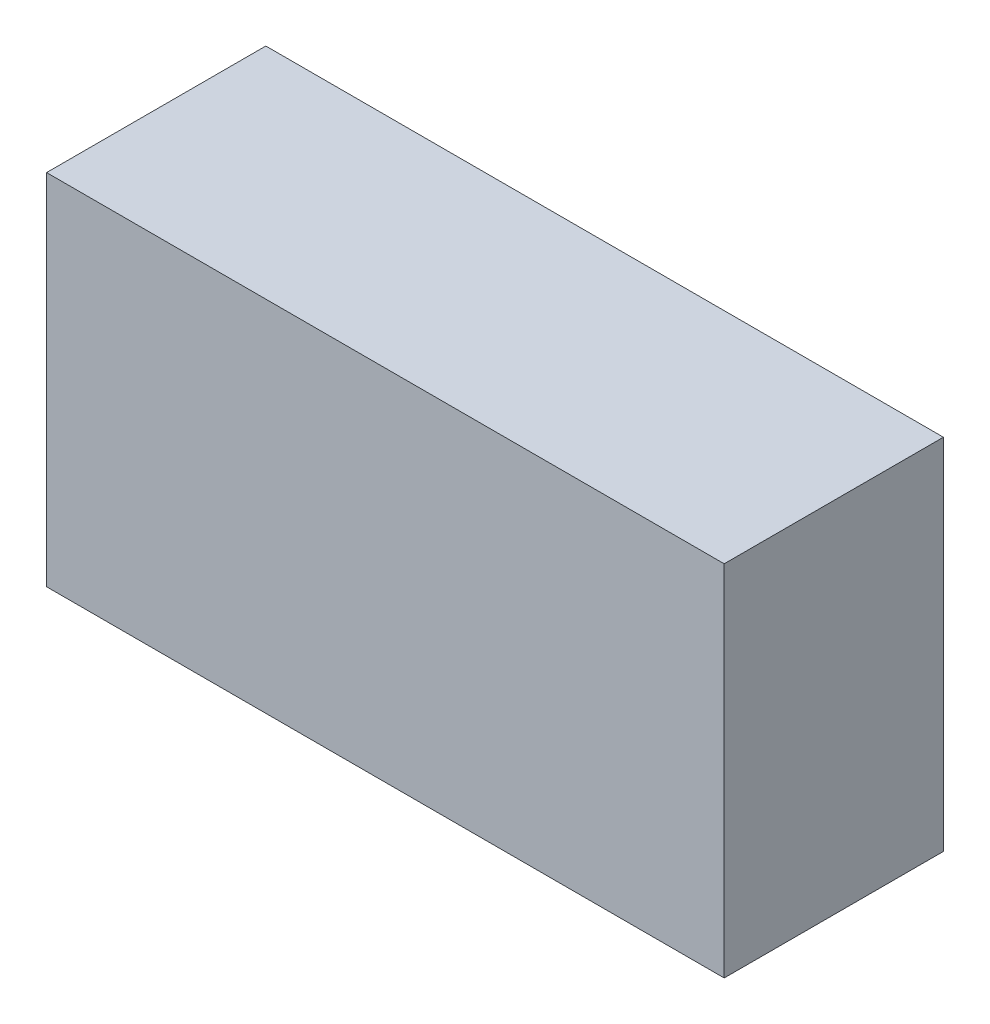
ISO-10303-21;
HEADER;
FILE_DESCRIPTION(('STEP AP214'),'2;1');
FILE_NAME('part.step','',(''),(''),'','','');
FILE_SCHEMA(('AUTOMOTIVE_DESIGN { 1 0 10303 214 1 1 1 1 }'));
ENDSEC;
DATA;
#1=APPLICATION_CONTEXT('core data for automotive mechanical design processes');
#2=APPLICATION_PROTOCOL_DEFINITION('international standard','automotive_design',2000,#1);
#3=PRODUCT_CONTEXT('',#1,'mechanical');
#4=PRODUCT('Part','Part','',(#3));
#5=PRODUCT_RELATED_PRODUCT_CATEGORY('part','',(#4));
#6=PRODUCT_DEFINITION_FORMATION('','',#4);
#7=PRODUCT_DEFINITION_CONTEXT('part definition',#1,'design');
#8=PRODUCT_DEFINITION('design','',#6,#7);
#9=PRODUCT_DEFINITION_SHAPE('','',#8);
#10=(LENGTH_UNIT() NAMED_UNIT(*) SI_UNIT(.MILLI.,.METRE.));
#11=(NAMED_UNIT(*) PLANE_ANGLE_UNIT() SI_UNIT($,.RADIAN.));
#12=(NAMED_UNIT(*) SI_UNIT($,.STERADIAN.) SOLID_ANGLE_UNIT());
#13=UNCERTAINTY_MEASURE_WITH_UNIT(LENGTH_MEASURE(1.E-05),#10,'distance_accuracy_value','');
#14=(GEOMETRIC_REPRESENTATION_CONTEXT(3) GLOBAL_UNCERTAINTY_ASSIGNED_CONTEXT((#13)) GLOBAL_UNIT_ASSIGNED_CONTEXT((#10,
#11,#12)) REPRESENTATION_CONTEXT('',''));
#15=CARTESIAN_POINT('',(0.,0.,0.));
#16=DIRECTION('',(0.,0.,1.));
#17=DIRECTION('',(1.,0.,0.));
#18=AXIS2_PLACEMENT_3D('',#15,#16,#17);
#19=CARTESIAN_POINT('',(3.,23.,-6.));
#20=DIRECTION('',(1.,0.,0.));
#21=DIRECTION('',(0.,0.,-1.));
#22=AXIS2_PLACEMENT_3D('',#19,#20,#21);
#23=PLANE('',#22);
#24=DIRECTION('',(0.,-1.,0.));
#25=VECTOR('',#24,1.);
#26=CARTESIAN_POINT('',(3.,23.,-17.));
#27=LINE('',#26,#25);
#28=CARTESIAN_POINT('',(3.,23.,-17.));
#29=VERTEX_POINT('',#28);
#30=CARTESIAN_POINT('',(3.,5.,-17.));
#31=VERTEX_POINT('',#30);
#32=EDGE_CURVE('E104',#29,#31,#27,.T.);
#33=ORIENTED_EDGE('',*,*,#32,.T.);
#34=DIRECTION('',(0.,0.,-1.));
#35=VECTOR('',#34,1.);
#36=CARTESIAN_POINT('',(3.,5.,-6.));
#37=LINE('',#36,#35);
#38=CARTESIAN_POINT('',(3.,5.,-6.));
#39=VERTEX_POINT('',#38);
#40=EDGE_CURVE('E11',#39,#31,#37,.T.);
#41=ORIENTED_EDGE('',*,*,#40,.F.);
#42=DIRECTION('',(0.,-1.,0.));
#43=VECTOR('',#42,1.);
#44=CARTESIAN_POINT('',(3.,23.,-6.));
#45=LINE('',#44,#43);
#46=CARTESIAN_POINT('',(3.,23.,-6.));
#47=VERTEX_POINT('',#46);
#48=EDGE_CURVE('E92',#47,#39,#45,.T.);
#49=ORIENTED_EDGE('',*,*,#48,.F.);
#50=DIRECTION('',(0.,0.,-1.));
#51=VECTOR('',#50,1.);
#52=CARTESIAN_POINT('',(3.,23.,-6.));
#53=LINE('',#52,#51);
#54=EDGE_CURVE('E100',#47,#29,#53,.T.);
#55=ORIENTED_EDGE('',*,*,#54,.T.);
#56=EDGE_LOOP('',(#33,#41,#49,#55));
#57=FACE_BOUND('',#56,.T.);
#58=ADVANCED_FACE('F41',(#57),#23,.F.);
#59=CARTESIAN_POINT('',(3.,5.,-6.));
#60=DIRECTION('',(0.,1.,0.));
#61=DIRECTION('',(0.,0.,1.));
#62=AXIS2_PLACEMENT_3D('',#59,#60,#61);
#63=PLANE('',#62);
#64=DIRECTION('',(1.,0.,0.));
#65=VECTOR('',#64,1.);
#66=CARTESIAN_POINT('',(3.,5.,-17.));
#67=LINE('',#66,#65);
#68=CARTESIAN_POINT('',(37.,5.,-17.));
#69=VERTEX_POINT('',#68);
#70=EDGE_CURVE('E96',#31,#69,#67,.T.);
#71=ORIENTED_EDGE('',*,*,#70,.T.);
#72=DIRECTION('',(0.,0.,-1.));
#73=VECTOR('',#72,1.);
#74=CARTESIAN_POINT('',(37.,5.,-6.));
#75=LINE('',#74,#73);
#76=CARTESIAN_POINT('',(37.,5.,-6.));
#77=VERTEX_POINT('',#76);
#78=EDGE_CURVE('E49',#77,#69,#75,.T.);
#79=ORIENTED_EDGE('',*,*,#78,.F.);
#80=DIRECTION('',(1.,0.,0.));
#81=VECTOR('',#80,1.);
#82=CARTESIAN_POINT('',(3.,5.,-6.));
#83=LINE('',#82,#81);
#84=EDGE_CURVE('E87',#39,#77,#83,.T.);
#85=ORIENTED_EDGE('',*,*,#84,.F.);
#86=ORIENTED_EDGE('',*,*,#40,.T.);
#87=EDGE_LOOP('',(#71,#79,#85,#86));
#88=FACE_BOUND('',#87,.T.);
#89=ADVANCED_FACE('F95',(#88),#63,.F.);
#90=CARTESIAN_POINT('',(37.,5.,-6.));
#91=DIRECTION('',(-1.,0.,0.));
#92=DIRECTION('',(0.,0.,1.));
#93=AXIS2_PLACEMENT_3D('',#90,#91,#92);
#94=PLANE('',#93);
#95=DIRECTION('',(0.,1.,0.));
#96=VECTOR('',#95,1.);
#97=CARTESIAN_POINT('',(37.,5.,-17.));
#98=LINE('',#97,#96);
#99=CARTESIAN_POINT('',(37.,23.,-17.));
#100=VERTEX_POINT('',#99);
#101=EDGE_CURVE('E74',#69,#100,#98,.T.);
#102=ORIENTED_EDGE('',*,*,#101,.T.);
#103=DIRECTION('',(0.,0.,-1.));
#104=VECTOR('',#103,1.);
#105=CARTESIAN_POINT('',(37.,23.,-6.));
#106=LINE('',#105,#104);
#107=CARTESIAN_POINT('',(37.,23.,-6.));
#108=VERTEX_POINT('',#107);
#109=EDGE_CURVE('E97',#108,#100,#106,.T.);
#110=ORIENTED_EDGE('',*,*,#109,.F.);
#111=DIRECTION('',(0.,1.,0.));
#112=VECTOR('',#111,1.);
#113=CARTESIAN_POINT('',(37.,5.,-6.));
#114=LINE('',#113,#112);
#115=EDGE_CURVE('E90',#77,#108,#114,.T.);
#116=ORIENTED_EDGE('',*,*,#115,.F.);
#117=ORIENTED_EDGE('',*,*,#78,.T.);
#118=EDGE_LOOP('',(#102,#110,#116,#117));
#119=FACE_BOUND('',#118,.T.);
#120=ADVANCED_FACE('F98',(#119),#94,.F.);
#121=CARTESIAN_POINT('',(37.,23.,-6.));
#122=DIRECTION('',(0.,-1.,0.));
#123=DIRECTION('',(0.,0.,-1.));
#124=AXIS2_PLACEMENT_3D('',#121,#122,#123);
#125=PLANE('',#124);
#126=DIRECTION('',(-1.,0.,0.));
#127=VECTOR('',#126,1.);
#128=CARTESIAN_POINT('',(37.,23.,-17.));
#129=LINE('',#128,#127);
#130=EDGE_CURVE('E80',#100,#29,#129,.T.);
#131=ORIENTED_EDGE('',*,*,#130,.T.);
#132=ORIENTED_EDGE('',*,*,#54,.F.);
#133=DIRECTION('',(-1.,0.,0.));
#134=VECTOR('',#133,1.);
#135=CARTESIAN_POINT('',(37.,23.,-6.));
#136=LINE('',#135,#134);
#137=EDGE_CURVE('E57',#108,#47,#136,.T.);
#138=ORIENTED_EDGE('',*,*,#137,.F.);
#139=ORIENTED_EDGE('',*,*,#109,.T.);
#140=EDGE_LOOP('',(#131,#132,#138,#139));
#141=FACE_BOUND('',#140,.T.);
#142=ADVANCED_FACE('F111',(#141),#125,.F.);
#143=CARTESIAN_POINT('',(0.,0.,-6.));
#144=DIRECTION('',(0.,0.,1.));
#145=DIRECTION('',(1.,0.,0.));
#146=AXIS2_PLACEMENT_3D('',#143,#144,#145);
#147=PLANE('',#146);
#148=ORIENTED_EDGE('',*,*,#48,.T.);
#149=ORIENTED_EDGE('',*,*,#84,.T.);
#150=ORIENTED_EDGE('',*,*,#115,.T.);
#151=ORIENTED_EDGE('',*,*,#137,.T.);
#152=EDGE_LOOP('',(#148,#149,#150,#151));
#153=FACE_BOUND('',#152,.T.);
#154=ADVANCED_FACE('F88',(#153),#147,.T.);
#155=CARTESIAN_POINT('',(0.,0.,-17.));
#156=DIRECTION('',(0.,0.,1.));
#157=DIRECTION('',(1.,0.,0.));
#158=AXIS2_PLACEMENT_3D('',#155,#156,#157);
#159=PLANE('',#158);
#160=ORIENTED_EDGE('',*,*,#32,.F.);
#161=ORIENTED_EDGE('',*,*,#130,.F.);
#162=ORIENTED_EDGE('',*,*,#101,.F.);
#163=ORIENTED_EDGE('',*,*,#70,.F.);
#164=EDGE_LOOP('',(#160,#161,#162,#163));
#165=FACE_BOUND('',#164,.T.);
#166=ADVANCED_FACE('F114',(#165),#159,.F.);
#167=CLOSED_SHELL('',(#58,#89,#120,#142,#154,#166));
#168=MANIFOLD_SOLID_BREP('B2',#167);
#169=ADVANCED_BREP_SHAPE_REPRESENTATION('',(#18,#168),#14);
#170=SHAPE_DEFINITION_REPRESENTATION(#9,#169);
ENDSEC;
END-ISO-10303-21;
